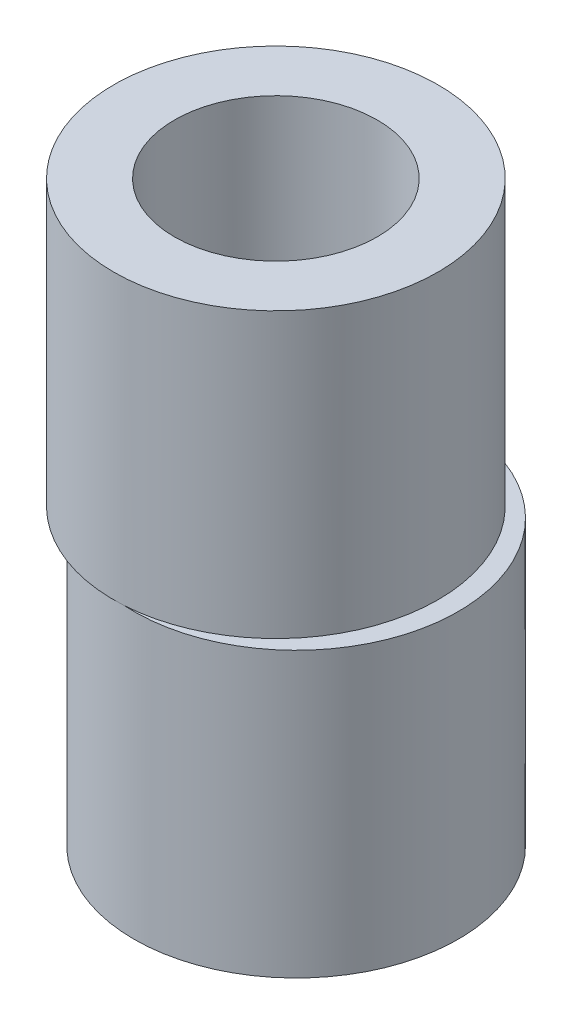
ISO-10303-21;
HEADER;
FILE_DESCRIPTION(('STEP AP214'),'2;1');
FILE_NAME('part.step','',(''),(''),'','','');
FILE_SCHEMA(('AUTOMOTIVE_DESIGN { 1 0 10303 214 1 1 1 1 }'));
ENDSEC;
DATA;
#1=APPLICATION_CONTEXT('core data for automotive mechanical design processes');
#2=APPLICATION_PROTOCOL_DEFINITION('international standard','automotive_design',2000,#1);
#3=PRODUCT_CONTEXT('',#1,'mechanical');
#4=PRODUCT('Part','Part','',(#3));
#5=PRODUCT_RELATED_PRODUCT_CATEGORY('part','',(#4));
#6=PRODUCT_DEFINITION_FORMATION('','',#4);
#7=PRODUCT_DEFINITION_CONTEXT('part definition',#1,'design');
#8=PRODUCT_DEFINITION('design','',#6,#7);
#9=PRODUCT_DEFINITION_SHAPE('','',#8);
#10=(LENGTH_UNIT() NAMED_UNIT(*) SI_UNIT(.MILLI.,.METRE.));
#11=(NAMED_UNIT(*) PLANE_ANGLE_UNIT() SI_UNIT($,.RADIAN.));
#12=(NAMED_UNIT(*) SI_UNIT($,.STERADIAN.) SOLID_ANGLE_UNIT());
#13=UNCERTAINTY_MEASURE_WITH_UNIT(LENGTH_MEASURE(1.E-05),#10,'distance_accuracy_value','');
#14=(GEOMETRIC_REPRESENTATION_CONTEXT(3) GLOBAL_UNCERTAINTY_ASSIGNED_CONTEXT((#13)) GLOBAL_UNIT_ASSIGNED_CONTEXT((#10,
#11,#12)) REPRESENTATION_CONTEXT('',''));
#15=CARTESIAN_POINT('',(0.,0.,0.));
#16=DIRECTION('',(0.,0.,1.));
#17=DIRECTION('',(1.,0.,0.));
#18=AXIS2_PLACEMENT_3D('',#15,#16,#17);
#19=CARTESIAN_POINT('',(0.,7.,0.));
#20=DIRECTION('',(0.,1.,0.));
#21=DIRECTION('',(0.,0.,1.));
#22=AXIS2_PLACEMENT_3D('',#19,#20,#21);
#23=PLANE('',#22);
#24=CARTESIAN_POINT('',(0.5,7.,0.));
#25=DIRECTION('',(0.,1.,0.));
#26=DIRECTION('',(0.,0.,1.));
#27=AXIS2_PLACEMENT_3D('',#24,#25,#26);
#28=CIRCLE('',#27,2.5);
#29=CARTESIAN_POINT('',(0.,7.,-2.44948974278318));
#30=VERTEX_POINT('',#29);
#31=CARTESIAN_POINT('',(0.,7.,2.44948974278318));
#32=VERTEX_POINT('',#31);
#33=EDGE_CURVE('E83',#30,#32,#28,.T.);
#34=ORIENTED_EDGE('',*,*,#33,.F.);
#35=CARTESIAN_POINT('',(-0.5,7.,0.));
#36=DIRECTION('',(0.,1.,0.));
#37=DIRECTION('',(0.,0.,1.));
#38=AXIS2_PLACEMENT_3D('',#35,#36,#37);
#39=CIRCLE('',#38,2.5);
#40=EDGE_CURVE('E11',#30,#32,#39,.T.);
#41=ORIENTED_EDGE('',*,*,#40,.T.);
#42=EDGE_LOOP('',(#34,#41));
#43=FACE_BOUND('',#42,.T.);
#44=ADVANCED_FACE('F35',(#43),#23,.T.);
#45=CARTESIAN_POINT('',(-0.5,7.,0.));
#46=DIRECTION('',(0.,1.,0.));
#47=DIRECTION('',(0.,0.,1.));
#48=AXIS2_PLACEMENT_3D('',#45,#46,#47);
#49=CIRCLE('',#48,4.);
#50=CARTESIAN_POINT('',(-0.25,7.,3.99217985566783));
#51=VERTEX_POINT('',#50);
#52=CARTESIAN_POINT('',(-0.25,7.,-3.99217985566783));
#53=VERTEX_POINT('',#52);
#54=EDGE_CURVE('E58',#51,#53,#49,.T.);
#55=ORIENTED_EDGE('',*,*,#54,.F.);
#56=CARTESIAN_POINT('',(0.,7.,0.));
#57=DIRECTION('',(0.,1.,0.));
#58=DIRECTION('',(0.,0.,1.));
#59=AXIS2_PLACEMENT_3D('',#56,#57,#58);
#60=CIRCLE('',#59,4.);
#61=EDGE_CURVE('E67',#51,#53,#60,.T.);
#62=ORIENTED_EDGE('',*,*,#61,.T.);
#63=EDGE_LOOP('',(#55,#62));
#64=FACE_BOUND('',#63,.T.);
#65=ADVANCED_FACE('F71',(#64),#23,.T.);
#66=CARTESIAN_POINT('',(0.,0.,0.));
#67=DIRECTION('',(0.,1.,0.));
#68=DIRECTION('',(0.,0.,1.));
#69=AXIS2_PLACEMENT_3D('',#66,#67,#68);
#70=PLANE('',#69);
#71=CARTESIAN_POINT('',(0.,0.,0.));
#72=DIRECTION('',(0.,1.,0.));
#73=DIRECTION('',(0.,0.,1.));
#74=AXIS2_PLACEMENT_3D('',#71,#72,#73);
#75=CIRCLE('',#74,4.);
#76=CARTESIAN_POINT('',(0.,0.,4.));
#77=VERTEX_POINT('',#76);
#78=EDGE_CURVE('E39',#77,#77,#75,.T.);
#79=ORIENTED_EDGE('',*,*,#78,.F.);
#80=EDGE_LOOP('',(#79));
#81=FACE_BOUND('',#80,.T.);
#82=CARTESIAN_POINT('',(0.5,0.,0.));
#83=DIRECTION('',(0.,1.,0.));
#84=DIRECTION('',(0.,0.,1.));
#85=AXIS2_PLACEMENT_3D('',#82,#83,#84);
#86=CIRCLE('',#85,2.5);
#87=CARTESIAN_POINT('',(0.5,0.,2.5));
#88=VERTEX_POINT('',#87);
#89=EDGE_CURVE('E80',#88,#88,#86,.T.);
#90=ORIENTED_EDGE('',*,*,#89,.T.);
#91=EDGE_LOOP('',(#90));
#92=FACE_BOUND('',#91,.T.);
#93=ADVANCED_FACE('F120',(#81,#92),#70,.F.);
#94=CARTESIAN_POINT('',(0.,7.,0.));
#95=DIRECTION('',(0.,-1.,0.));
#96=DIRECTION('',(0.,0.,-1.));
#97=AXIS2_PLACEMENT_3D('',#94,#95,#96);
#98=CYLINDRICAL_SURFACE('',#97,4.);
#99=EDGE_CURVE('E44',#53,#51,#60,.T.);
#100=ORIENTED_EDGE('',*,*,#99,.F.);
#101=ORIENTED_EDGE('',*,*,#61,.F.);
#102=EDGE_LOOP('',(#100,#101));
#103=FACE_BOUND('',#102,.T.);
#104=ORIENTED_EDGE('',*,*,#78,.T.);
#105=EDGE_LOOP('',(#104));
#106=FACE_BOUND('',#105,.T.);
#107=ADVANCED_FACE('F37',(#103,#106),#98,.T.);
#108=CARTESIAN_POINT('',(0.5,7.,0.));
#109=DIRECTION('',(0.,-1.,0.));
#110=DIRECTION('',(0.,0.,-1.));
#111=AXIS2_PLACEMENT_3D('',#108,#109,#110);
#112=CYLINDRICAL_SURFACE('',#111,2.5);
#113=ORIENTED_EDGE('',*,*,#33,.T.);
#114=EDGE_CURVE('E86',#32,#30,#28,.T.);
#115=ORIENTED_EDGE('',*,*,#114,.T.);
#116=EDGE_LOOP('',(#113,#115));
#117=FACE_BOUND('',#116,.T.);
#118=ORIENTED_EDGE('',*,*,#89,.F.);
#119=EDGE_LOOP('',(#118));
#120=FACE_BOUND('',#119,.T.);
#121=ADVANCED_FACE('F93',(#117,#120),#112,.F.);
#122=CARTESIAN_POINT('',(-0.5,7.,0.));
#123=DIRECTION('',(0.,1.,0.));
#124=DIRECTION('',(0.,0.,1.));
#125=AXIS2_PLACEMENT_3D('',#122,#123,#124);
#126=PLANE('',#125);
#127=EDGE_CURVE('E72',#53,#51,#49,.T.);
#128=ORIENTED_EDGE('',*,*,#127,.F.);
#129=ORIENTED_EDGE('',*,*,#99,.T.);
#130=EDGE_LOOP('',(#128,#129));
#131=FACE_BOUND('',#130,.T.);
#132=ADVANCED_FACE('F73',(#131),#126,.F.);
#133=CARTESIAN_POINT('',(-0.5,14.,0.));
#134=DIRECTION('',(0.,1.,0.));
#135=DIRECTION('',(0.,0.,1.));
#136=AXIS2_PLACEMENT_3D('',#133,#134,#135);
#137=PLANE('',#136);
#138=CARTESIAN_POINT('',(-0.5,14.,0.));
#139=DIRECTION('',(0.,1.,0.));
#140=DIRECTION('',(0.,0.,1.));
#141=AXIS2_PLACEMENT_3D('',#138,#139,#140);
#142=CIRCLE('',#141,4.);
#143=CARTESIAN_POINT('',(-0.5,14.,4.));
#144=VERTEX_POINT('',#143);
#145=EDGE_CURVE('E78',#144,#144,#142,.T.);
#146=ORIENTED_EDGE('',*,*,#145,.T.);
#147=EDGE_LOOP('',(#146));
#148=FACE_BOUND('',#147,.T.);
#149=CARTESIAN_POINT('',(-0.5,14.,0.));
#150=DIRECTION('',(0.,1.,0.));
#151=DIRECTION('',(0.,0.,1.));
#152=AXIS2_PLACEMENT_3D('',#149,#150,#151);
#153=CIRCLE('',#152,2.5);
#154=CARTESIAN_POINT('',(-0.5,14.,2.5));
#155=VERTEX_POINT('',#154);
#156=EDGE_CURVE('E75',#155,#155,#153,.T.);
#157=ORIENTED_EDGE('',*,*,#156,.F.);
#158=EDGE_LOOP('',(#157));
#159=FACE_BOUND('',#158,.T.);
#160=ADVANCED_FACE('F104',(#148,#159),#137,.T.);
#161=ORIENTED_EDGE('',*,*,#114,.F.);
#162=EDGE_CURVE('E46',#32,#30,#39,.T.);
#163=ORIENTED_EDGE('',*,*,#162,.T.);
#164=EDGE_LOOP('',(#161,#163));
#165=FACE_BOUND('',#164,.T.);
#166=ADVANCED_FACE('F98',(#165),#126,.F.);
#167=CARTESIAN_POINT('',(-0.5,14.,0.));
#168=DIRECTION('',(0.,-1.,0.));
#169=DIRECTION('',(0.,0.,-1.));
#170=AXIS2_PLACEMENT_3D('',#167,#168,#169);
#171=CYLINDRICAL_SURFACE('',#170,4.);
#172=ORIENTED_EDGE('',*,*,#145,.F.);
#173=EDGE_LOOP('',(#172));
#174=FACE_BOUND('',#173,.T.);
#175=ORIENTED_EDGE('',*,*,#54,.T.);
#176=ORIENTED_EDGE('',*,*,#127,.T.);
#177=EDGE_LOOP('',(#175,#176));
#178=FACE_BOUND('',#177,.T.);
#179=ADVANCED_FACE('F77',(#174,#178),#171,.T.);
#180=CARTESIAN_POINT('',(-0.5,14.,0.));
#181=DIRECTION('',(0.,-1.,0.));
#182=DIRECTION('',(0.,0.,-1.));
#183=AXIS2_PLACEMENT_3D('',#180,#181,#182);
#184=CYLINDRICAL_SURFACE('',#183,2.5);
#185=ORIENTED_EDGE('',*,*,#156,.T.);
#186=EDGE_LOOP('',(#185));
#187=FACE_BOUND('',#186,.T.);
#188=ORIENTED_EDGE('',*,*,#162,.F.);
#189=ORIENTED_EDGE('',*,*,#40,.F.);
#190=EDGE_LOOP('',(#188,#189));
#191=FACE_BOUND('',#190,.T.);
#192=ADVANCED_FACE('F97',(#187,#191),#184,.F.);
#193=CLOSED_SHELL('',(#44,#65,#93,#107,#121,#132,#160,#166,#179,#192));
#194=MANIFOLD_SOLID_BREP('B2',#193);
#195=ADVANCED_BREP_SHAPE_REPRESENTATION('',(#18,#194),#14);
#196=SHAPE_DEFINITION_REPRESENTATION(#9,#195);
ENDSEC;
END-ISO-10303-21;
